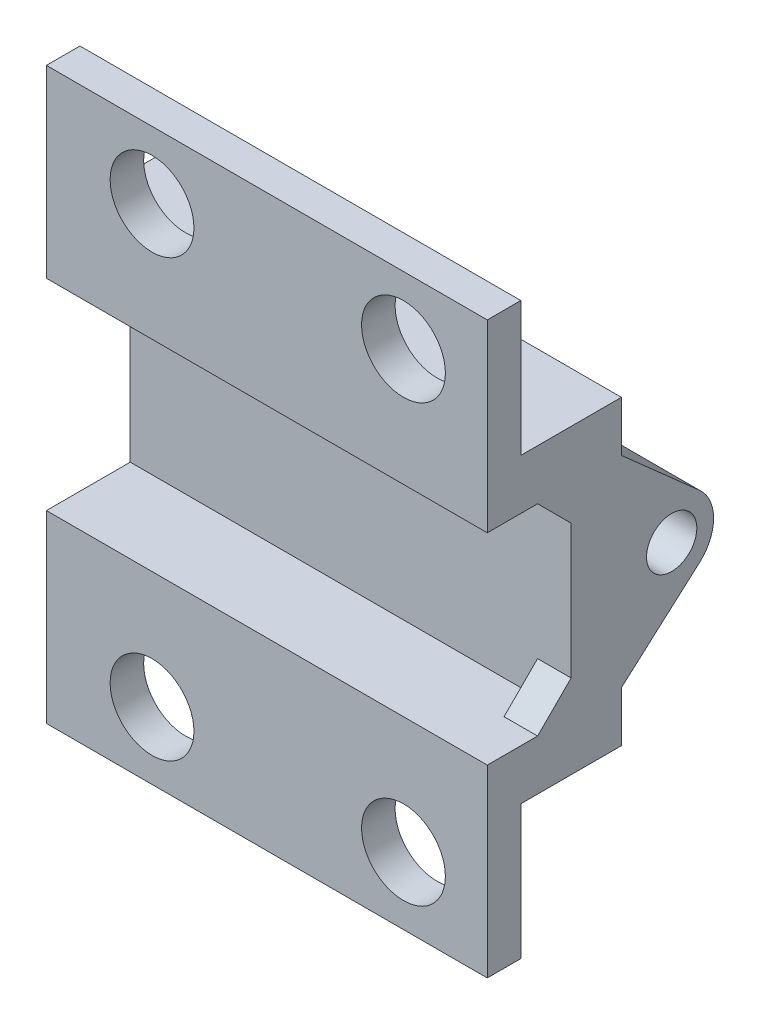
ISO-10303-21;
HEADER;
FILE_DESCRIPTION(('STEP AP214'),'2;1');
FILE_NAME('part.step','',(''),(''),'','','');
FILE_SCHEMA(('AUTOMOTIVE_DESIGN { 1 0 10303 214 1 1 1 1 }'));
ENDSEC;
DATA;
#1=APPLICATION_CONTEXT('core data for automotive mechanical design processes');
#2=APPLICATION_PROTOCOL_DEFINITION('international standard','automotive_design',2000,#1);
#3=PRODUCT_CONTEXT('',#1,'mechanical');
#4=PRODUCT('Part','Part','',(#3));
#5=PRODUCT_RELATED_PRODUCT_CATEGORY('part','',(#4));
#6=PRODUCT_DEFINITION_FORMATION('','',#4);
#7=PRODUCT_DEFINITION_CONTEXT('part definition',#1,'design');
#8=PRODUCT_DEFINITION('design','',#6,#7);
#9=PRODUCT_DEFINITION_SHAPE('','',#8);
#10=(LENGTH_UNIT() NAMED_UNIT(*) SI_UNIT(.MILLI.,.METRE.));
#11=(NAMED_UNIT(*) PLANE_ANGLE_UNIT() SI_UNIT($,.RADIAN.));
#12=(NAMED_UNIT(*) SI_UNIT($,.STERADIAN.) SOLID_ANGLE_UNIT());
#13=UNCERTAINTY_MEASURE_WITH_UNIT(LENGTH_MEASURE(1.E-05),#10,'distance_accuracy_value','');
#14=(GEOMETRIC_REPRESENTATION_CONTEXT(3) GLOBAL_UNCERTAINTY_ASSIGNED_CONTEXT((#13)) GLOBAL_UNIT_ASSIGNED_CONTEXT((#10,
#11,#12)) REPRESENTATION_CONTEXT('',''));
#15=CARTESIAN_POINT('',(0.,0.,0.));
#16=DIRECTION('',(0.,0.,1.));
#17=DIRECTION('',(1.,0.,0.));
#18=AXIS2_PLACEMENT_3D('',#15,#16,#17);
#19=CARTESIAN_POINT('',(14.15,-9.,-3.));
#20=DIRECTION('',(0.,1.,0.));
#21=DIRECTION('',(0.,0.,1.));
#22=AXIS2_PLACEMENT_3D('',#19,#20,#21);
#23=PLANE('',#22);
#24=DIRECTION('',(1.,0.,0.));
#25=VECTOR('',#24,1.);
#26=CARTESIAN_POINT('',(-20.3962112512353,-9.,3.));
#27=LINE('',#26,#25);
#28=CARTESIAN_POINT('',(-12.15,-9.,3.));
#29=VERTEX_POINT('',#28);
#30=CARTESIAN_POINT('',(14.15,-9.,3.));
#31=VERTEX_POINT('',#30);
#32=EDGE_CURVE('E52',#29,#31,#27,.T.);
#33=ORIENTED_EDGE('',*,*,#32,.F.);
#34=DIRECTION('',(0.,0.,-1.));
#35=VECTOR('',#34,1.);
#36=CARTESIAN_POINT('',(-12.15,-9.,5.));
#37=LINE('',#36,#35);
#38=CARTESIAN_POINT('',(-12.15,-9.,-3.));
#39=VERTEX_POINT('',#38);
#40=EDGE_CURVE('E248',#29,#39,#37,.T.);
#41=ORIENTED_EDGE('',*,*,#40,.T.);
#42=DIRECTION('',(-1.,0.,0.));
#43=VECTOR('',#42,1.);
#44=CARTESIAN_POINT('',(14.15,-9.,-3.));
#45=LINE('',#44,#43);
#46=CARTESIAN_POINT('',(14.15,-9.,-3.));
#47=VERTEX_POINT('',#46);
#48=EDGE_CURVE('E350',#47,#39,#45,.T.);
#49=ORIENTED_EDGE('',*,*,#48,.F.);
#50=DIRECTION('',(0.,0.,-1.));
#51=VECTOR('',#50,1.);
#52=CARTESIAN_POINT('',(14.15,-9.,-3.));
#53=LINE('',#52,#51);
#54=EDGE_CURVE('E186',#31,#47,#53,.T.);
#55=ORIENTED_EDGE('',*,*,#54,.F.);
#56=EDGE_LOOP('',(#33,#41,#49,#55));
#57=FACE_BOUND('',#56,.T.);
#58=ADVANCED_FACE('F35',(#57),#23,.F.);
#59=CARTESIAN_POINT('',(0.,9.,5.));
#60=DIRECTION('',(0.,1.,0.));
#61=DIRECTION('',(0.,0.,1.));
#62=AXIS2_PLACEMENT_3D('',#59,#60,#61);
#63=PLANE('',#62);
#64=DIRECTION('',(0.,0.,-1.));
#65=VECTOR('',#64,1.);
#66=CARTESIAN_POINT('',(-12.15,9.,5.));
#67=LINE('',#66,#65);
#68=CARTESIAN_POINT('',(-12.15,9.,3.));
#69=VERTEX_POINT('',#68);
#70=CARTESIAN_POINT('',(-12.15,9.,-3.));
#71=VERTEX_POINT('',#70);
#72=EDGE_CURVE('E11',#69,#71,#67,.T.);
#73=ORIENTED_EDGE('',*,*,#72,.F.);
#74=DIRECTION('',(1.,0.,0.));
#75=VECTOR('',#74,1.);
#76=CARTESIAN_POINT('',(-20.3962112512353,9.,3.));
#77=LINE('',#76,#75);
#78=CARTESIAN_POINT('',(14.15,9.,3.));
#79=VERTEX_POINT('',#78);
#80=EDGE_CURVE('E232',#69,#79,#77,.T.);
#81=ORIENTED_EDGE('',*,*,#80,.T.);
#82=DIRECTION('',(0.,0.,1.));
#83=VECTOR('',#82,1.);
#84=CARTESIAN_POINT('',(14.15,9.,5.));
#85=LINE('',#84,#83);
#86=CARTESIAN_POINT('',(14.15,9.,-3.));
#87=VERTEX_POINT('',#86);
#88=EDGE_CURVE('E285',#87,#79,#85,.T.);
#89=ORIENTED_EDGE('',*,*,#88,.F.);
#90=DIRECTION('',(-1.,0.,0.));
#91=VECTOR('',#90,1.);
#92=CARTESIAN_POINT('',(14.15,9.,-3.));
#93=LINE('',#92,#91);
#94=EDGE_CURVE('E362',#87,#71,#93,.T.);
#95=ORIENTED_EDGE('',*,*,#94,.T.);
#96=EDGE_LOOP('',(#73,#81,#89,#95));
#97=FACE_BOUND('',#96,.T.);
#98=ADVANCED_FACE('F37',(#97),#63,.T.);
#99=CARTESIAN_POINT('',(14.15,9.,-3.));
#100=DIRECTION('',(0.,0.,1.));
#101=DIRECTION('',(1.,0.,0.));
#102=AXIS2_PLACEMENT_3D('',#99,#100,#101);
#103=PLANE('',#102);
#104=DIRECTION('',(1.,0.,0.));
#105=VECTOR('',#104,1.);
#106=CARTESIAN_POINT('',(8.15,6.,-3.));
#107=LINE('',#106,#105);
#108=CARTESIAN_POINT('',(8.15,6.,-3.));
#109=VERTEX_POINT('',#108);
#110=CARTESIAN_POINT('',(14.15,6.,-3.));
#111=VERTEX_POINT('',#110);
#112=EDGE_CURVE('E459',#109,#111,#107,.T.);
#113=ORIENTED_EDGE('',*,*,#112,.F.);
#114=DIRECTION('',(0.,1.,0.));
#115=VECTOR('',#114,1.);
#116=CARTESIAN_POINT('',(8.15,0.,-3.));
#117=LINE('',#116,#115);
#118=CARTESIAN_POINT('',(8.15,-6.,-3.));
#119=VERTEX_POINT('',#118);
#120=EDGE_CURVE('E461',#119,#109,#117,.T.);
#121=ORIENTED_EDGE('',*,*,#120,.F.);
#122=DIRECTION('',(1.,0.,0.));
#123=VECTOR('',#122,1.);
#124=CARTESIAN_POINT('',(8.15,-6.,-3.));
#125=LINE('',#124,#123);
#126=CARTESIAN_POINT('',(14.15,-6.,-3.));
#127=VERTEX_POINT('',#126);
#128=EDGE_CURVE('E339',#119,#127,#125,.T.);
#129=ORIENTED_EDGE('',*,*,#128,.T.);
#130=DIRECTION('',(0.,1.,0.));
#131=VECTOR('',#130,1.);
#132=CARTESIAN_POINT('',(14.15,9.,-3.));
#133=LINE('',#132,#131);
#134=EDGE_CURVE('E282',#47,#127,#133,.T.);
#135=ORIENTED_EDGE('',*,*,#134,.F.);
#136=ORIENTED_EDGE('',*,*,#48,.T.);
#137=DIRECTION('',(0.,1.,0.));
#138=VECTOR('',#137,1.);
#139=CARTESIAN_POINT('',(-12.15,9.,-3.));
#140=LINE('',#139,#138);
#141=EDGE_CURVE('E322',#39,#71,#140,.T.);
#142=ORIENTED_EDGE('',*,*,#141,.T.);
#143=ORIENTED_EDGE('',*,*,#94,.F.);
#144=EDGE_CURVE('E279',#111,#87,#133,.T.);
#145=ORIENTED_EDGE('',*,*,#144,.F.);
#146=EDGE_LOOP('',(#113,#121,#129,#135,#136,#142,#143,#145));
#147=FACE_BOUND('',#146,.T.);
#148=ADVANCED_FACE('F382',(#147),#103,.F.);
#149=CARTESIAN_POINT('',(12.15,0.,0.));
#150=DIRECTION('',(-1.,0.,0.));
#151=DIRECTION('',(0.,0.,1.));
#152=AXIS2_PLACEMENT_3D('',#149,#150,#151);
#153=PLANE('',#152);
#154=DIRECTION('',(0.,0.,-1.));
#155=VECTOR('',#154,1.);
#156=CARTESIAN_POINT('',(12.15,6.,5.));
#157=LINE('',#156,#155);
#158=CARTESIAN_POINT('',(12.15,6.,2.00000000000001));
#159=VERTEX_POINT('',#158);
#160=CARTESIAN_POINT('',(12.15,6.,0.));
#161=VERTEX_POINT('',#160);
#162=EDGE_CURVE('E297',#159,#161,#157,.T.);
#163=ORIENTED_EDGE('',*,*,#162,.T.);
#164=DIRECTION('',(0.,-1.,0.));
#165=VECTOR('',#164,1.);
#166=CARTESIAN_POINT('',(12.15,9.,0.));
#167=LINE('',#166,#165);
#168=CARTESIAN_POINT('',(12.15,4.,0.));
#169=VERTEX_POINT('',#168);
#170=EDGE_CURVE('E323',#161,#169,#167,.T.);
#171=ORIENTED_EDGE('',*,*,#170,.T.);
#172=DIRECTION('',(0.,-0.707106781186547,-0.707106781186548));
#173=VECTOR('',#172,1.);
#174=CARTESIAN_POINT('',(12.15,4.,0.));
#175=LINE('',#174,#173);
#176=EDGE_CURVE('E261',#159,#169,#175,.T.);
#177=ORIENTED_EDGE('',*,*,#176,.F.);
#178=EDGE_LOOP('',(#163,#171,#177));
#179=FACE_BOUND('',#178,.T.);
#180=ADVANCED_FACE('F446',(#179),#153,.T.);
#181=DIRECTION('',(0.,-0.707106781186548,0.707106781186548));
#182=VECTOR('',#181,1.);
#183=CARTESIAN_POINT('',(12.15,-6.,2.));
#184=LINE('',#183,#182);
#185=CARTESIAN_POINT('',(12.15,-4.,0.));
#186=VERTEX_POINT('',#185);
#187=CARTESIAN_POINT('',(12.15,-6.,2.));
#188=VERTEX_POINT('',#187);
#189=EDGE_CURVE('E265',#186,#188,#184,.T.);
#190=ORIENTED_EDGE('',*,*,#189,.F.);
#191=CARTESIAN_POINT('',(12.15,-6.,0.));
#192=VERTEX_POINT('',#191);
#193=EDGE_CURVE('E327',#186,#192,#167,.T.);
#194=ORIENTED_EDGE('',*,*,#193,.T.);
#195=DIRECTION('',(0.,0.,-1.));
#196=VECTOR('',#195,1.);
#197=CARTESIAN_POINT('',(12.15,-6.,5.));
#198=LINE('',#197,#196);
#199=EDGE_CURVE('E258',#188,#192,#198,.T.);
#200=ORIENTED_EDGE('',*,*,#199,.F.);
#201=EDGE_LOOP('',(#190,#194,#200));
#202=FACE_BOUND('',#201,.T.);
#203=ADVANCED_FACE('F337',(#202),#153,.T.);
#204=CARTESIAN_POINT('',(-12.15,0.,5.));
#205=DIRECTION('',(1.,0.,0.));
#206=DIRECTION('',(0.,1.,0.));
#207=AXIS2_PLACEMENT_3D('',#204,#205,#206);
#208=PLANE('',#207);
#209=DIRECTION('',(0.,-1.,0.));
#210=VECTOR('',#209,1.);
#211=CARTESIAN_POINT('',(-12.15,0.,5.));
#212=LINE('',#211,#210);
#213=CARTESIAN_POINT('',(-12.15,17.,5.));
#214=VERTEX_POINT('',#213);
#215=CARTESIAN_POINT('',(-12.15,6.,5.));
#216=VERTEX_POINT('',#215);
#217=EDGE_CURVE('E316',#214,#216,#212,.T.);
#218=ORIENTED_EDGE('',*,*,#217,.F.);
#219=DIRECTION('',(0.,0.,-1.));
#220=VECTOR('',#219,1.);
#221=CARTESIAN_POINT('',(-12.15,17.,5.));
#222=LINE('',#221,#220);
#223=CARTESIAN_POINT('',(-12.15,17.,3.));
#224=VERTEX_POINT('',#223);
#225=EDGE_CURVE('E226',#214,#224,#222,.T.);
#226=ORIENTED_EDGE('',*,*,#225,.T.);
#227=DIRECTION('',(0.,-1.,0.));
#228=VECTOR('',#227,1.);
#229=CARTESIAN_POINT('',(-12.15,9.,3.));
#230=LINE('',#229,#228);
#231=EDGE_CURVE('E229',#224,#69,#230,.T.);
#232=ORIENTED_EDGE('',*,*,#231,.T.);
#233=ORIENTED_EDGE('',*,*,#72,.T.);
#234=ORIENTED_EDGE('',*,*,#141,.F.);
#235=ORIENTED_EDGE('',*,*,#40,.F.);
#236=DIRECTION('',(0.,-1.,0.));
#237=VECTOR('',#236,1.);
#238=CARTESIAN_POINT('',(-12.15,-9.,3.));
#239=LINE('',#238,#237);
#240=CARTESIAN_POINT('',(-12.15,-17.,3.));
#241=VERTEX_POINT('',#240);
#242=EDGE_CURVE('E214',#29,#241,#239,.T.);
#243=ORIENTED_EDGE('',*,*,#242,.T.);
#244=DIRECTION('',(0.,0.,1.));
#245=VECTOR('',#244,1.);
#246=CARTESIAN_POINT('',(-12.15,-17.,5.));
#247=LINE('',#246,#245);
#248=CARTESIAN_POINT('',(-12.15,-17.,5.));
#249=VERTEX_POINT('',#248);
#250=EDGE_CURVE('E219',#241,#249,#247,.T.);
#251=ORIENTED_EDGE('',*,*,#250,.T.);
#252=DIRECTION('',(0.,-1.,0.));
#253=VECTOR('',#252,1.);
#254=CARTESIAN_POINT('',(-12.15,0.,5.));
#255=LINE('',#254,#253);
#256=CARTESIAN_POINT('',(-12.15,-6.,5.));
#257=VERTEX_POINT('',#256);
#258=EDGE_CURVE('E192',#257,#249,#255,.T.);
#259=ORIENTED_EDGE('',*,*,#258,.F.);
#260=DIRECTION('',(0.,0.,-1.));
#261=VECTOR('',#260,1.);
#262=CARTESIAN_POINT('',(-12.15,-6.,5.));
#263=LINE('',#262,#261);
#264=CARTESIAN_POINT('',(-12.15,-6.,0.));
#265=VERTEX_POINT('',#264);
#266=EDGE_CURVE('E250',#257,#265,#263,.T.);
#267=ORIENTED_EDGE('',*,*,#266,.T.);
#268=DIRECTION('',(0.,1.,0.));
#269=VECTOR('',#268,1.);
#270=CARTESIAN_POINT('',(-12.15,9.,0.));
#271=LINE('',#270,#269);
#272=CARTESIAN_POINT('',(-12.15,6.,0.));
#273=VERTEX_POINT('',#272);
#274=EDGE_CURVE('E318',#265,#273,#271,.T.);
#275=ORIENTED_EDGE('',*,*,#274,.T.);
#276=DIRECTION('',(0.,0.,-1.));
#277=VECTOR('',#276,1.);
#278=CARTESIAN_POINT('',(-12.15,6.,5.));
#279=LINE('',#278,#277);
#280=EDGE_CURVE('E44',#216,#273,#279,.T.);
#281=ORIENTED_EDGE('',*,*,#280,.F.);
#282=EDGE_LOOP('',(#218,#226,#232,#233,#234,#235,#243,#251,#259,#267,#275,#281));
#283=FACE_BOUND('',#282,.T.);
#284=ADVANCED_FACE('F315',(#283),#208,.F.);
#285=CARTESIAN_POINT('',(0.,6.,5.));
#286=DIRECTION('',(0.,1.,0.));
#287=DIRECTION('',(0.,0.,1.));
#288=AXIS2_PLACEMENT_3D('',#285,#286,#287);
#289=PLANE('',#288);
#290=DIRECTION('',(1.,0.,0.));
#291=VECTOR('',#290,1.);
#292=CARTESIAN_POINT('',(0.,6.,0.));
#293=LINE('',#292,#291);
#294=EDGE_CURVE('E291',#273,#161,#293,.T.);
#295=ORIENTED_EDGE('',*,*,#294,.T.);
#296=ORIENTED_EDGE('',*,*,#162,.F.);
#297=DIRECTION('',(-1.,0.,0.));
#298=VECTOR('',#297,1.);
#299=CARTESIAN_POINT('',(14.15,5.99999999999999,2.));
#300=LINE('',#299,#298);
#301=CARTESIAN_POINT('',(14.15,5.99999999999999,2.));
#302=VERTEX_POINT('',#301);
#303=EDGE_CURVE('E288',#302,#159,#300,.T.);
#304=ORIENTED_EDGE('',*,*,#303,.F.);
#305=DIRECTION('',(0.,0.,-1.));
#306=VECTOR('',#305,1.);
#307=CARTESIAN_POINT('',(14.15,5.99999999999999,2.));
#308=LINE('',#307,#306);
#309=CARTESIAN_POINT('',(14.15,6.00000000000001,5.));
#310=VERTEX_POINT('',#309);
#311=EDGE_CURVE('E262',#310,#302,#308,.T.);
#312=ORIENTED_EDGE('',*,*,#311,.F.);
#313=DIRECTION('',(1.,0.,0.));
#314=VECTOR('',#313,1.);
#315=CARTESIAN_POINT('',(0.,6.,5.));
#316=LINE('',#315,#314);
#317=EDGE_CURVE('E301',#216,#310,#316,.T.);
#318=ORIENTED_EDGE('',*,*,#317,.F.);
#319=ORIENTED_EDGE('',*,*,#280,.T.);
#320=EDGE_LOOP('',(#295,#296,#304,#312,#318,#319));
#321=FACE_BOUND('',#320,.T.);
#322=ADVANCED_FACE('F312',(#321),#289,.F.);
#323=CARTESIAN_POINT('',(0.,0.,5.));
#324=DIRECTION('',(0.,0.,1.));
#325=DIRECTION('',(1.,0.,0.));
#326=AXIS2_PLACEMENT_3D('',#323,#324,#325);
#327=PLANE('',#326);
#328=CARTESIAN_POINT('',(-5.85,13.,5.));
#329=DIRECTION('',(0.,0.,1.));
#330=DIRECTION('',(1.,0.,0.));
#331=AXIS2_PLACEMENT_3D('',#328,#329,#330);
#332=CIRCLE('',#331,2.5);
#333=CARTESIAN_POINT('',(-3.35,13.,5.));
#334=VERTEX_POINT('',#333);
#335=EDGE_CURVE('E625',#334,#334,#332,.F.);
#336=ORIENTED_EDGE('',*,*,#335,.T.);
#337=EDGE_LOOP('',(#336));
#338=FACE_BOUND('',#337,.T.);
#339=CARTESIAN_POINT('',(9.15,13.,5.));
#340=DIRECTION('',(0.,0.,1.));
#341=DIRECTION('',(1.,0.,0.));
#342=AXIS2_PLACEMENT_3D('',#339,#340,#341);
#343=CIRCLE('',#342,2.5);
#344=CARTESIAN_POINT('',(11.65,13.,5.));
#345=VERTEX_POINT('',#344);
#346=EDGE_CURVE('E629',#345,#345,#343,.F.);
#347=ORIENTED_EDGE('',*,*,#346,.T.);
#348=EDGE_LOOP('',(#347));
#349=FACE_BOUND('',#348,.T.);
#350=ORIENTED_EDGE('',*,*,#317,.T.);
#351=DIRECTION('',(0.,-1.,0.));
#352=VECTOR('',#351,1.);
#353=CARTESIAN_POINT('',(14.15,6.00000000000001,5.));
#354=LINE('',#353,#352);
#355=CARTESIAN_POINT('',(14.15,17.,5.));
#356=VERTEX_POINT('',#355);
#357=EDGE_CURVE('E359',#356,#310,#354,.T.);
#358=ORIENTED_EDGE('',*,*,#357,.F.);
#359=DIRECTION('',(1.,0.,0.));
#360=VECTOR('',#359,1.);
#361=CARTESIAN_POINT('',(-20.3962112512353,17.,5.));
#362=LINE('',#361,#360);
#363=EDGE_CURVE('E233',#214,#356,#362,.T.);
#364=ORIENTED_EDGE('',*,*,#363,.F.);
#365=ORIENTED_EDGE('',*,*,#217,.T.);
#366=EDGE_LOOP('',(#350,#358,#364,#365));
#367=FACE_BOUND('',#366,.T.);
#368=ADVANCED_FACE('F357',(#338,#349,#367),#327,.T.);
#369=CARTESIAN_POINT('',(14.15,4.,0.));
#370=DIRECTION('',(0.,0.707106781186548,-0.707106781186547));
#371=DIRECTION('',(0.,0.707106781186547,0.707106781186548));
#372=AXIS2_PLACEMENT_3D('',#369,#370,#371);
#373=PLANE('',#372);
#374=ORIENTED_EDGE('',*,*,#176,.T.);
#375=DIRECTION('',(-1.,0.,0.));
#376=VECTOR('',#375,1.);
#377=CARTESIAN_POINT('',(14.15,4.,0.));
#378=LINE('',#377,#376);
#379=CARTESIAN_POINT('',(14.15,4.,0.));
#380=VERTEX_POINT('',#379);
#381=EDGE_CURVE('E292',#380,#169,#378,.T.);
#382=ORIENTED_EDGE('',*,*,#381,.F.);
#383=DIRECTION('',(0.,-0.707106781186547,-0.707106781186548));
#384=VECTOR('',#383,1.);
#385=CARTESIAN_POINT('',(14.15,4.,0.));
#386=LINE('',#385,#384);
#387=EDGE_CURVE('E264',#302,#380,#386,.T.);
#388=ORIENTED_EDGE('',*,*,#387,.F.);
#389=ORIENTED_EDGE('',*,*,#303,.T.);
#390=EDGE_LOOP('',(#374,#382,#388,#389));
#391=FACE_BOUND('',#390,.T.);
#392=ADVANCED_FACE('F365',(#391),#373,.F.);
#393=CARTESIAN_POINT('',(14.15,-4.,0.));
#394=DIRECTION('',(0.,0.,-1.));
#395=DIRECTION('',(0.,1.,0.));
#396=AXIS2_PLACEMENT_3D('',#393,#394,#395);
#397=PLANE('',#396);
#398=ORIENTED_EDGE('',*,*,#381,.T.);
#399=ORIENTED_EDGE('',*,*,#170,.F.);
#400=ORIENTED_EDGE('',*,*,#294,.F.);
#401=ORIENTED_EDGE('',*,*,#274,.F.);
#402=DIRECTION('',(1.,0.,0.));
#403=VECTOR('',#402,1.);
#404=CARTESIAN_POINT('',(0.,-6.,0.));
#405=LINE('',#404,#403);
#406=EDGE_CURVE('E254',#265,#192,#405,.T.);
#407=ORIENTED_EDGE('',*,*,#406,.T.);
#408=ORIENTED_EDGE('',*,*,#193,.F.);
#409=DIRECTION('',(-1.,0.,0.));
#410=VECTOR('',#409,1.);
#411=CARTESIAN_POINT('',(14.15,-4.,0.));
#412=LINE('',#411,#410);
#413=CARTESIAN_POINT('',(14.15,-4.,0.));
#414=VERTEX_POINT('',#413);
#415=EDGE_CURVE('E346',#414,#186,#412,.T.);
#416=ORIENTED_EDGE('',*,*,#415,.F.);
#417=DIRECTION('',(0.,-1.,0.));
#418=VECTOR('',#417,1.);
#419=CARTESIAN_POINT('',(14.15,-4.,0.));
#420=LINE('',#419,#418);
#421=EDGE_CURVE('E267',#380,#414,#420,.T.);
#422=ORIENTED_EDGE('',*,*,#421,.F.);
#423=EDGE_LOOP('',(#398,#399,#400,#401,#407,#408,#416,#422));
#424=FACE_BOUND('',#423,.T.);
#425=ADVANCED_FACE('F331',(#424),#397,.F.);
#426=CARTESIAN_POINT('',(14.15,-6.,2.));
#427=DIRECTION('',(0.,-0.707106781186547,-0.707106781186547));
#428=DIRECTION('',(0.,0.707106781186548,-0.707106781186548));
#429=AXIS2_PLACEMENT_3D('',#426,#427,#428);
#430=PLANE('',#429);
#431=ORIENTED_EDGE('',*,*,#189,.T.);
#432=DIRECTION('',(-1.,0.,0.));
#433=VECTOR('',#432,1.);
#434=CARTESIAN_POINT('',(14.15,-6.,2.));
#435=LINE('',#434,#433);
#436=CARTESIAN_POINT('',(14.15,-6.,2.));
#437=VERTEX_POINT('',#436);
#438=EDGE_CURVE('E343',#437,#188,#435,.T.);
#439=ORIENTED_EDGE('',*,*,#438,.F.);
#440=DIRECTION('',(0.,-0.707106781186548,0.707106781186548));
#441=VECTOR('',#440,1.);
#442=CARTESIAN_POINT('',(14.15,-6.,2.));
#443=LINE('',#442,#441);
#444=EDGE_CURVE('E269',#414,#437,#443,.T.);
#445=ORIENTED_EDGE('',*,*,#444,.F.);
#446=ORIENTED_EDGE('',*,*,#415,.T.);
#447=EDGE_LOOP('',(#431,#439,#445,#446));
#448=FACE_BOUND('',#447,.T.);
#449=ADVANCED_FACE('F368',(#448),#430,.F.);
#450=CARTESIAN_POINT('',(14.15,-6.00000000000001,5.00000000000001));
#451=DIRECTION('',(0.,-1.,0.));
#452=DIRECTION('',(0.,0.,-1.));
#453=AXIS2_PLACEMENT_3D('',#450,#451,#452);
#454=PLANE('',#453);
#455=ORIENTED_EDGE('',*,*,#438,.T.);
#456=ORIENTED_EDGE('',*,*,#199,.T.);
#457=ORIENTED_EDGE('',*,*,#406,.F.);
#458=ORIENTED_EDGE('',*,*,#266,.F.);
#459=DIRECTION('',(-1.,0.,0.));
#460=VECTOR('',#459,1.);
#461=CARTESIAN_POINT('',(14.15,-6.00000000000001,5.00000000000001));
#462=LINE('',#461,#460);
#463=CARTESIAN_POINT('',(14.15,-6.00000000000001,5.00000000000001));
#464=VERTEX_POINT('',#463);
#465=EDGE_CURVE('E347',#464,#257,#462,.T.);
#466=ORIENTED_EDGE('',*,*,#465,.F.);
#467=DIRECTION('',(0.,0.,1.));
#468=VECTOR('',#467,1.);
#469=CARTESIAN_POINT('',(14.15,-6.00000000000001,5.00000000000001));
#470=LINE('',#469,#468);
#471=EDGE_CURVE('E183',#437,#464,#470,.T.);
#472=ORIENTED_EDGE('',*,*,#471,.F.);
#473=EDGE_LOOP('',(#455,#456,#457,#458,#466,#472));
#474=FACE_BOUND('',#473,.T.);
#475=ADVANCED_FACE('F341',(#474),#454,.F.);
#476=CARTESIAN_POINT('',(14.15,-9.,5.00000000000001));
#477=DIRECTION('',(0.,0.,-1.));
#478=DIRECTION('',(0.,1.,0.));
#479=AXIS2_PLACEMENT_3D('',#476,#477,#478);
#480=PLANE('',#479);
#481=CARTESIAN_POINT('',(9.15,-13.,5.));
#482=DIRECTION('',(0.,0.,1.));
#483=DIRECTION('',(1.,0.,0.));
#484=AXIS2_PLACEMENT_3D('',#481,#482,#483);
#485=CIRCLE('',#484,2.5);
#486=CARTESIAN_POINT('',(11.65,-13.,5.));
#487=VERTEX_POINT('',#486);
#488=EDGE_CURVE('E397',#487,#487,#485,.F.);
#489=ORIENTED_EDGE('',*,*,#488,.T.);
#490=EDGE_LOOP('',(#489));
#491=FACE_BOUND('',#490,.T.);
#492=CARTESIAN_POINT('',(-5.85,-13.,5.));
#493=DIRECTION('',(0.,0.,1.));
#494=DIRECTION('',(1.,0.,0.));
#495=AXIS2_PLACEMENT_3D('',#492,#493,#494);
#496=CIRCLE('',#495,2.5);
#497=CARTESIAN_POINT('',(-3.35,-13.,5.));
#498=VERTEX_POINT('',#497);
#499=EDGE_CURVE('E202',#498,#498,#496,.F.);
#500=ORIENTED_EDGE('',*,*,#499,.T.);
#501=EDGE_LOOP('',(#500));
#502=FACE_BOUND('',#501,.T.);
#503=ORIENTED_EDGE('',*,*,#465,.T.);
#504=ORIENTED_EDGE('',*,*,#258,.T.);
#505=DIRECTION('',(1.,0.,0.));
#506=VECTOR('',#505,1.);
#507=CARTESIAN_POINT('',(-20.3962112512353,-17.,5.));
#508=LINE('',#507,#506);
#509=CARTESIAN_POINT('',(14.15,-17.,5.));
#510=VERTEX_POINT('',#509);
#511=EDGE_CURVE('E189',#249,#510,#508,.T.);
#512=ORIENTED_EDGE('',*,*,#511,.T.);
#513=DIRECTION('',(0.,-1.,0.));
#514=VECTOR('',#513,1.);
#515=CARTESIAN_POINT('',(14.15,-9.,5.00000000000001));
#516=LINE('',#515,#514);
#517=EDGE_CURVE('E174',#464,#510,#516,.T.);
#518=ORIENTED_EDGE('',*,*,#517,.F.);
#519=EDGE_LOOP('',(#503,#504,#512,#518));
#520=FACE_BOUND('',#519,.T.);
#521=ADVANCED_FACE('F190',(#491,#502,#520),#480,.F.);
#522=CARTESIAN_POINT('',(14.15,0.,0.));
#523=DIRECTION('',(-1.,0.,0.));
#524=DIRECTION('',(0.,0.,1.));
#525=AXIS2_PLACEMENT_3D('',#522,#523,#524);
#526=PLANE('',#525);
#527=ORIENTED_EDGE('',*,*,#311,.T.);
#528=ORIENTED_EDGE('',*,*,#387,.T.);
#529=ORIENTED_EDGE('',*,*,#421,.T.);
#530=ORIENTED_EDGE('',*,*,#444,.T.);
#531=ORIENTED_EDGE('',*,*,#471,.T.);
#532=ORIENTED_EDGE('',*,*,#517,.T.);
#533=DIRECTION('',(0.,0.,-1.));
#534=VECTOR('',#533,1.);
#535=CARTESIAN_POINT('',(14.15,-17.,5.));
#536=LINE('',#535,#534);
#537=CARTESIAN_POINT('',(14.15,-17.,3.));
#538=VERTEX_POINT('',#537);
#539=EDGE_CURVE('E181',#510,#538,#536,.T.);
#540=ORIENTED_EDGE('',*,*,#539,.T.);
#541=DIRECTION('',(0.,1.,0.));
#542=VECTOR('',#541,1.);
#543=CARTESIAN_POINT('',(14.15,-9.,3.));
#544=LINE('',#543,#542);
#545=EDGE_CURVE('E197',#538,#31,#544,.T.);
#546=ORIENTED_EDGE('',*,*,#545,.T.);
#547=ORIENTED_EDGE('',*,*,#54,.T.);
#548=ORIENTED_EDGE('',*,*,#134,.T.);
#549=DIRECTION('',(0.,0.663326639865916,-0.748329986599624));
#550=VECTOR('',#549,1.);
#551=CARTESIAN_POINT('',(14.15,-4.84914825963127,-4.29832998659962));
#552=LINE('',#551,#550);
#553=CARTESIAN_POINT('',(14.15,-1.87082496649906,-7.65831659966479));
#554=VERTEX_POINT('',#553);
#555=EDGE_CURVE('E228',#127,#554,#552,.T.);
#556=ORIENTED_EDGE('',*,*,#555,.T.);
#557=CARTESIAN_POINT('',(14.15,0.,-6.));
#558=DIRECTION('',(1.,0.,0.));
#559=DIRECTION('',(0.,0.,-1.));
#560=AXIS2_PLACEMENT_3D('',#557,#558,#559);
#561=CIRCLE('',#560,2.5);
#562=CARTESIAN_POINT('',(14.15,1.87082496649906,-7.65831659966479));
#563=VERTEX_POINT('',#562);
#564=EDGE_CURVE('E479',#554,#563,#561,.T.);
#565=ORIENTED_EDGE('',*,*,#564,.T.);
#566=DIRECTION('',(0.,-0.663326639865916,-0.748329986599624));
#567=VECTOR('',#566,1.);
#568=CARTESIAN_POINT('',(14.15,4.84914825963127,-4.29832998659962));
#569=LINE('',#568,#567);
#570=EDGE_CURVE('E476',#111,#563,#569,.T.);
#571=ORIENTED_EDGE('',*,*,#570,.F.);
#572=ORIENTED_EDGE('',*,*,#144,.T.);
#573=ORIENTED_EDGE('',*,*,#88,.T.);
#574=DIRECTION('',(0.,1.,0.));
#575=VECTOR('',#574,1.);
#576=CARTESIAN_POINT('',(14.15,9.,3.));
#577=LINE('',#576,#575);
#578=CARTESIAN_POINT('',(14.15,17.,3.));
#579=VERTEX_POINT('',#578);
#580=EDGE_CURVE('E60',#79,#579,#577,.T.);
#581=ORIENTED_EDGE('',*,*,#580,.T.);
#582=DIRECTION('',(0.,0.,1.));
#583=VECTOR('',#582,1.);
#584=CARTESIAN_POINT('',(14.15,17.,5.));
#585=LINE('',#584,#583);
#586=EDGE_CURVE('E223',#579,#356,#585,.T.);
#587=ORIENTED_EDGE('',*,*,#586,.T.);
#588=ORIENTED_EDGE('',*,*,#357,.T.);
#589=EDGE_LOOP('',(#527,#528,#529,#530,#531,#532,#540,#546,#547,#548,#556,#565,#571,#572,#573,
#581,#587,#588));
#590=FACE_BOUND('',#589,.T.);
#591=CARTESIAN_POINT('',(14.15,0.,-6.));
#592=DIRECTION('',(1.,0.,0.));
#593=DIRECTION('',(0.,0.,-1.));
#594=AXIS2_PLACEMENT_3D('',#591,#592,#593);
#595=CIRCLE('',#594,1.5);
#596=CARTESIAN_POINT('',(14.15,0.,-7.5));
#597=VERTEX_POINT('',#596);
#598=EDGE_CURVE('E478',#597,#597,#595,.T.);
#599=ORIENTED_EDGE('',*,*,#598,.F.);
#600=EDGE_LOOP('',(#599));
#601=FACE_BOUND('',#600,.T.);
#602=ADVANCED_FACE('F177',(#590,#601),#526,.F.);
#603=CARTESIAN_POINT('',(8.15,-4.84914825963127,-4.29832998659962));
#604=DIRECTION('',(0.,-0.748329986599624,-0.663326639865916));
#605=DIRECTION('',(0.,0.663326639865916,-0.748329986599624));
#606=AXIS2_PLACEMENT_3D('',#603,#604,#605);
#607=PLANE('',#606);
#608=ORIENTED_EDGE('',*,*,#555,.F.);
#609=ORIENTED_EDGE('',*,*,#128,.F.);
#610=DIRECTION('',(0.,0.663326639865916,-0.748329986599624));
#611=VECTOR('',#610,1.);
#612=CARTESIAN_POINT('',(8.15,-4.84914825963127,-4.29832998659962));
#613=LINE('',#612,#611);
#614=CARTESIAN_POINT('',(8.15,-1.87082496649906,-7.65831659966479));
#615=VERTEX_POINT('',#614);
#616=EDGE_CURVE('E240',#119,#615,#613,.T.);
#617=ORIENTED_EDGE('',*,*,#616,.T.);
#618=DIRECTION('',(1.,0.,0.));
#619=VECTOR('',#618,1.);
#620=CARTESIAN_POINT('',(8.15,-1.87082496649906,-7.65831659966479));
#621=LINE('',#620,#619);
#622=EDGE_CURVE('E469',#615,#554,#621,.T.);
#623=ORIENTED_EDGE('',*,*,#622,.T.);
#624=EDGE_LOOP('',(#608,#609,#617,#623));
#625=FACE_BOUND('',#624,.T.);
#626=ADVANCED_FACE('F392',(#625),#607,.T.);
#627=CARTESIAN_POINT('',(8.15,4.84914825963127,-4.29832998659962));
#628=DIRECTION('',(0.,-0.748329986599624,0.663326639865916));
#629=DIRECTION('',(0.,-0.663326639865916,-0.748329986599624));
#630=AXIS2_PLACEMENT_3D('',#627,#628,#629);
#631=PLANE('',#630);
#632=ORIENTED_EDGE('',*,*,#570,.T.);
#633=DIRECTION('',(1.,0.,0.));
#634=VECTOR('',#633,1.);
#635=CARTESIAN_POINT('',(8.15,1.87082496649906,-7.65831659966479));
#636=LINE('',#635,#634);
#637=CARTESIAN_POINT('',(8.15,1.87082496649906,-7.65831659966479));
#638=VERTEX_POINT('',#637);
#639=EDGE_CURVE('E466',#638,#563,#636,.T.);
#640=ORIENTED_EDGE('',*,*,#639,.F.);
#641=DIRECTION('',(0.,-0.663326639865916,-0.748329986599624));
#642=VECTOR('',#641,1.);
#643=CARTESIAN_POINT('',(8.15,4.84914825963127,-4.29832998659962));
#644=LINE('',#643,#642);
#645=EDGE_CURVE('E511',#109,#638,#644,.T.);
#646=ORIENTED_EDGE('',*,*,#645,.F.);
#647=ORIENTED_EDGE('',*,*,#112,.T.);
#648=EDGE_LOOP('',(#632,#640,#646,#647));
#649=FACE_BOUND('',#648,.T.);
#650=ADVANCED_FACE('F437',(#649),#631,.F.);
#651=CARTESIAN_POINT('',(8.15,0.,-6.));
#652=DIRECTION('',(1.,0.,0.));
#653=DIRECTION('',(0.,0.,-1.));
#654=AXIS2_PLACEMENT_3D('',#651,#652,#653);
#655=CYLINDRICAL_SURFACE('',#654,2.5);
#656=ORIENTED_EDGE('',*,*,#564,.F.);
#657=ORIENTED_EDGE('',*,*,#622,.F.);
#658=CARTESIAN_POINT('',(8.15,0.,-6.));
#659=DIRECTION('',(1.,0.,0.));
#660=DIRECTION('',(0.,0.,-1.));
#661=AXIS2_PLACEMENT_3D('',#658,#659,#660);
#662=CIRCLE('',#661,2.5);
#663=EDGE_CURVE('E513',#615,#638,#662,.T.);
#664=ORIENTED_EDGE('',*,*,#663,.T.);
#665=ORIENTED_EDGE('',*,*,#639,.T.);
#666=EDGE_LOOP('',(#656,#657,#664,#665));
#667=FACE_BOUND('',#666,.T.);
#668=ADVANCED_FACE('F435',(#667),#655,.T.);
#669=CARTESIAN_POINT('',(8.15,0.,-6.));
#670=DIRECTION('',(1.,0.,0.));
#671=DIRECTION('',(0.,0.,-1.));
#672=AXIS2_PLACEMENT_3D('',#669,#670,#671);
#673=CYLINDRICAL_SURFACE('',#672,1.5);
#674=CARTESIAN_POINT('',(8.15,0.,-6.));
#675=DIRECTION('',(1.,0.,0.));
#676=DIRECTION('',(0.,0.,-1.));
#677=AXIS2_PLACEMENT_3D('',#674,#675,#676);
#678=CIRCLE('',#677,1.5);
#679=CARTESIAN_POINT('',(8.15,0.,-7.5));
#680=VERTEX_POINT('',#679);
#681=EDGE_CURVE('E502',#680,#680,#678,.T.);
#682=ORIENTED_EDGE('',*,*,#681,.F.);
#683=EDGE_LOOP('',(#682));
#684=FACE_BOUND('',#683,.T.);
#685=ORIENTED_EDGE('',*,*,#598,.T.);
#686=EDGE_LOOP('',(#685));
#687=FACE_BOUND('',#686,.T.);
#688=ADVANCED_FACE('F431',(#684,#687),#673,.F.);
#689=CARTESIAN_POINT('',(8.15,0.,0.));
#690=DIRECTION('',(1.,0.,0.));
#691=DIRECTION('',(0.,0.,-1.));
#692=AXIS2_PLACEMENT_3D('',#689,#690,#691);
#693=PLANE('',#692);
#694=ORIENTED_EDGE('',*,*,#616,.F.);
#695=ORIENTED_EDGE('',*,*,#120,.T.);
#696=ORIENTED_EDGE('',*,*,#645,.T.);
#697=ORIENTED_EDGE('',*,*,#663,.F.);
#698=EDGE_LOOP('',(#694,#695,#696,#697));
#699=FACE_BOUND('',#698,.T.);
#700=ORIENTED_EDGE('',*,*,#681,.T.);
#701=EDGE_LOOP('',(#700));
#702=FACE_BOUND('',#701,.T.);
#703=ADVANCED_FACE('F424',(#699,#702),#693,.F.);
#704=CARTESIAN_POINT('',(-20.3962112512353,17.,5.));
#705=DIRECTION('',(0.,1.,0.));
#706=DIRECTION('',(0.,0.,1.));
#707=AXIS2_PLACEMENT_3D('',#704,#705,#706);
#708=PLANE('',#707);
#709=ORIENTED_EDGE('',*,*,#225,.F.);
#710=ORIENTED_EDGE('',*,*,#363,.T.);
#711=ORIENTED_EDGE('',*,*,#586,.F.);
#712=DIRECTION('',(1.,0.,0.));
#713=VECTOR('',#712,1.);
#714=CARTESIAN_POINT('',(-20.3962112512353,17.,3.));
#715=LINE('',#714,#713);
#716=EDGE_CURVE('E236',#224,#579,#715,.T.);
#717=ORIENTED_EDGE('',*,*,#716,.F.);
#718=EDGE_LOOP('',(#709,#710,#711,#717));
#719=FACE_BOUND('',#718,.T.);
#720=ADVANCED_FACE('F421',(#719),#708,.T.);
#721=CARTESIAN_POINT('',(-20.3962112512353,9.,3.));
#722=DIRECTION('',(0.,0.,-1.));
#723=DIRECTION('',(-1.,0.,0.));
#724=AXIS2_PLACEMENT_3D('',#721,#722,#723);
#725=PLANE('',#724);
#726=CARTESIAN_POINT('',(-5.85,13.,3.));
#727=DIRECTION('',(0.,0.,-1.));
#728=DIRECTION('',(-1.,0.,0.));
#729=AXIS2_PLACEMENT_3D('',#726,#727,#728);
#730=CIRCLE('',#729,2.5);
#731=CARTESIAN_POINT('',(-8.35,13.,3.));
#732=VERTEX_POINT('',#731);
#733=EDGE_CURVE('E622',#732,#732,#730,.T.);
#734=ORIENTED_EDGE('',*,*,#733,.F.);
#735=EDGE_LOOP('',(#734));
#736=FACE_BOUND('',#735,.T.);
#737=CARTESIAN_POINT('',(9.15,13.,3.));
#738=DIRECTION('',(0.,0.,-1.));
#739=DIRECTION('',(-1.,0.,0.));
#740=AXIS2_PLACEMENT_3D('',#737,#738,#739);
#741=CIRCLE('',#740,2.5);
#742=CARTESIAN_POINT('',(6.65,13.,3.));
#743=VERTEX_POINT('',#742);
#744=EDGE_CURVE('E626',#743,#743,#741,.T.);
#745=ORIENTED_EDGE('',*,*,#744,.F.);
#746=EDGE_LOOP('',(#745));
#747=FACE_BOUND('',#746,.T.);
#748=ORIENTED_EDGE('',*,*,#231,.F.);
#749=ORIENTED_EDGE('',*,*,#716,.T.);
#750=ORIENTED_EDGE('',*,*,#580,.F.);
#751=ORIENTED_EDGE('',*,*,#80,.F.);
#752=EDGE_LOOP('',(#748,#749,#750,#751));
#753=FACE_BOUND('',#752,.T.);
#754=ADVANCED_FACE('F418',(#736,#747,#753),#725,.T.);
#755=CARTESIAN_POINT('',(-20.3962112512353,-9.,3.));
#756=DIRECTION('',(0.,0.,-1.));
#757=DIRECTION('',(0.,1.,0.));
#758=AXIS2_PLACEMENT_3D('',#755,#756,#757);
#759=PLANE('',#758);
#760=CARTESIAN_POINT('',(9.15,-13.,3.));
#761=DIRECTION('',(0.,0.,-1.));
#762=DIRECTION('',(-1.,0.,0.));
#763=AXIS2_PLACEMENT_3D('',#760,#761,#762);
#764=CIRCLE('',#763,2.5);
#765=CARTESIAN_POINT('',(6.65,-13.,3.));
#766=VERTEX_POINT('',#765);
#767=EDGE_CURVE('E635',#766,#766,#764,.T.);
#768=ORIENTED_EDGE('',*,*,#767,.F.);
#769=EDGE_LOOP('',(#768));
#770=FACE_BOUND('',#769,.T.);
#771=CARTESIAN_POINT('',(-5.85,-13.,3.));
#772=DIRECTION('',(0.,0.,-1.));
#773=DIRECTION('',(-1.,0.,0.));
#774=AXIS2_PLACEMENT_3D('',#771,#772,#773);
#775=CIRCLE('',#774,2.5);
#776=CARTESIAN_POINT('',(-8.35,-13.,3.));
#777=VERTEX_POINT('',#776);
#778=EDGE_CURVE('E206',#777,#777,#775,.T.);
#779=ORIENTED_EDGE('',*,*,#778,.F.);
#780=EDGE_LOOP('',(#779));
#781=FACE_BOUND('',#780,.T.);
#782=ORIENTED_EDGE('',*,*,#242,.F.);
#783=ORIENTED_EDGE('',*,*,#32,.T.);
#784=ORIENTED_EDGE('',*,*,#545,.F.);
#785=DIRECTION('',(1.,0.,0.));
#786=VECTOR('',#785,1.);
#787=CARTESIAN_POINT('',(-20.3962112512353,-17.,3.));
#788=LINE('',#787,#786);
#789=EDGE_CURVE('E196',#241,#538,#788,.T.);
#790=ORIENTED_EDGE('',*,*,#789,.F.);
#791=EDGE_LOOP('',(#782,#783,#784,#790));
#792=FACE_BOUND('',#791,.T.);
#793=ADVANCED_FACE('F412',(#770,#781,#792),#759,.T.);
#794=CARTESIAN_POINT('',(-20.3962112512353,-17.,5.));
#795=DIRECTION('',(0.,-1.,0.));
#796=DIRECTION('',(0.,0.,-1.));
#797=AXIS2_PLACEMENT_3D('',#794,#795,#796);
#798=PLANE('',#797);
#799=ORIENTED_EDGE('',*,*,#250,.F.);
#800=ORIENTED_EDGE('',*,*,#789,.T.);
#801=ORIENTED_EDGE('',*,*,#539,.F.);
#802=ORIENTED_EDGE('',*,*,#511,.F.);
#803=EDGE_LOOP('',(#799,#800,#801,#802));
#804=FACE_BOUND('',#803,.T.);
#805=ADVANCED_FACE('F199',(#804),#798,.T.);
#806=CARTESIAN_POINT('',(-5.85,-13.,12.0710678118655));
#807=DIRECTION('',(0.,0.,-1.));
#808=DIRECTION('',(-1.,0.,0.));
#809=AXIS2_PLACEMENT_3D('',#806,#807,#808);
#810=CYLINDRICAL_SURFACE('',#809,2.5);
#811=ORIENTED_EDGE('',*,*,#778,.T.);
#812=EDGE_LOOP('',(#811));
#813=FACE_BOUND('',#812,.T.);
#814=ORIENTED_EDGE('',*,*,#499,.F.);
#815=EDGE_LOOP('',(#814));
#816=FACE_BOUND('',#815,.T.);
#817=ADVANCED_FACE('F400',(#813,#816),#810,.F.);
#818=CARTESIAN_POINT('',(9.15,-13.,12.0710678118655));
#819=DIRECTION('',(0.,0.,-1.));
#820=DIRECTION('',(-1.,0.,0.));
#821=AXIS2_PLACEMENT_3D('',#818,#819,#820);
#822=CYLINDRICAL_SURFACE('',#821,2.5);
#823=ORIENTED_EDGE('',*,*,#767,.T.);
#824=EDGE_LOOP('',(#823));
#825=FACE_BOUND('',#824,.T.);
#826=ORIENTED_EDGE('',*,*,#488,.F.);
#827=EDGE_LOOP('',(#826));
#828=FACE_BOUND('',#827,.T.);
#829=ADVANCED_FACE('F402',(#825,#828),#822,.F.);
#830=CARTESIAN_POINT('',(9.15,13.,12.0710678118655));
#831=DIRECTION('',(0.,0.,-1.));
#832=DIRECTION('',(-1.,0.,0.));
#833=AXIS2_PLACEMENT_3D('',#830,#831,#832);
#834=CYLINDRICAL_SURFACE('',#833,2.5);
#835=ORIENTED_EDGE('',*,*,#744,.T.);
#836=EDGE_LOOP('',(#835));
#837=FACE_BOUND('',#836,.T.);
#838=ORIENTED_EDGE('',*,*,#346,.F.);
#839=EDGE_LOOP('',(#838));
#840=FACE_BOUND('',#839,.T.);
#841=ADVANCED_FACE('F409',(#837,#840),#834,.F.);
#842=CARTESIAN_POINT('',(-5.85,13.,12.0710678118655));
#843=DIRECTION('',(0.,0.,-1.));
#844=DIRECTION('',(-1.,0.,0.));
#845=AXIS2_PLACEMENT_3D('',#842,#843,#844);
#846=CYLINDRICAL_SURFACE('',#845,2.5);
#847=ORIENTED_EDGE('',*,*,#733,.T.);
#848=EDGE_LOOP('',(#847));
#849=FACE_BOUND('',#848,.T.);
#850=ORIENTED_EDGE('',*,*,#335,.F.);
#851=EDGE_LOOP('',(#850));
#852=FACE_BOUND('',#851,.T.);
#853=ADVANCED_FACE('F606',(#849,#852),#846,.F.);
#854=CLOSED_SHELL('',(#58,#98,#148,#180,#203,#284,#322,#368,#392,#425,#449,#475,#521,#602,#626,
#650,#668,#688,#703,#720,#754,#793,#805,#817,#829,#841,#853));
#855=MANIFOLD_SOLID_BREP('B2',#854);
#856=ADVANCED_BREP_SHAPE_REPRESENTATION('',(#18,#855),#14);
#857=SHAPE_DEFINITION_REPRESENTATION(#9,#856);
ENDSEC;
END-ISO-10303-21;
